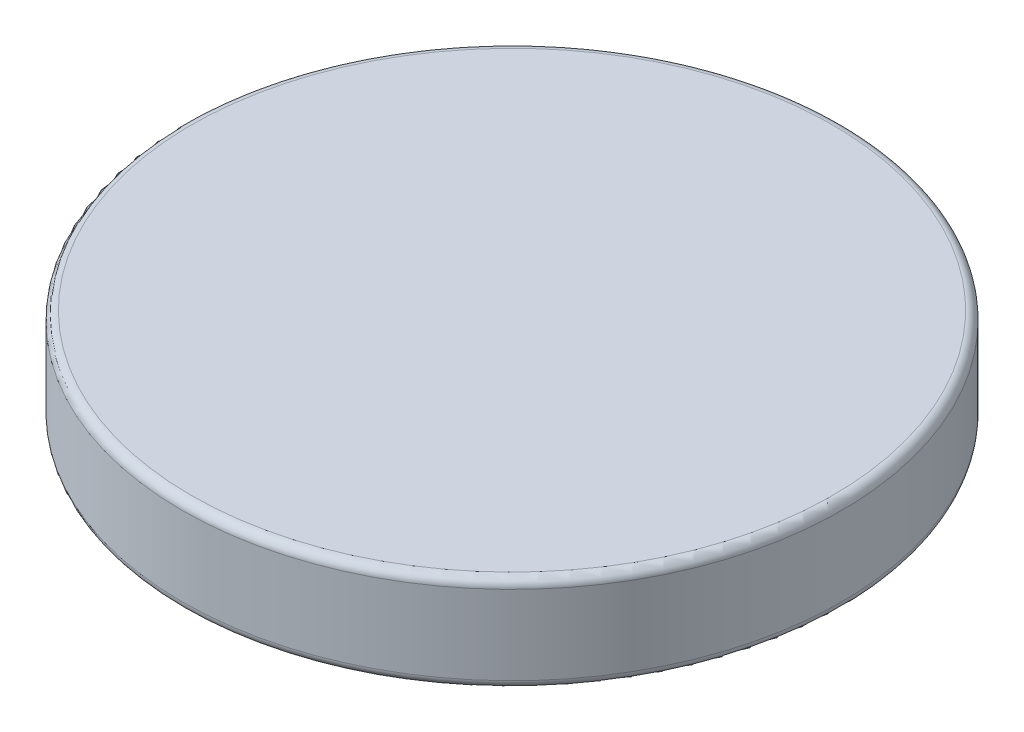
ISO-10303-21;
HEADER;
FILE_DESCRIPTION(('STEP AP214'),'2;1');
FILE_NAME('part.step','',(''),(''),'','','');
FILE_SCHEMA(('AUTOMOTIVE_DESIGN { 1 0 10303 214 1 1 1 1 }'));
ENDSEC;
DATA;
#1=APPLICATION_CONTEXT('core data for automotive mechanical design processes');
#2=APPLICATION_PROTOCOL_DEFINITION('international standard','automotive_design',2000,#1);
#3=PRODUCT_CONTEXT('',#1,'mechanical');
#4=PRODUCT('Part','Part','',(#3));
#5=PRODUCT_RELATED_PRODUCT_CATEGORY('part','',(#4));
#6=PRODUCT_DEFINITION_FORMATION('','',#4);
#7=PRODUCT_DEFINITION_CONTEXT('part definition',#1,'design');
#8=PRODUCT_DEFINITION('design','',#6,#7);
#9=PRODUCT_DEFINITION_SHAPE('','',#8);
#10=(LENGTH_UNIT() NAMED_UNIT(*) SI_UNIT(.MILLI.,.METRE.));
#11=(NAMED_UNIT(*) PLANE_ANGLE_UNIT() SI_UNIT($,.RADIAN.));
#12=(NAMED_UNIT(*) SI_UNIT($,.STERADIAN.) SOLID_ANGLE_UNIT());
#13=UNCERTAINTY_MEASURE_WITH_UNIT(LENGTH_MEASURE(1.E-05),#10,'distance_accuracy_value','');
#14=(GEOMETRIC_REPRESENTATION_CONTEXT(3) GLOBAL_UNCERTAINTY_ASSIGNED_CONTEXT((#13)) GLOBAL_UNIT_ASSIGNED_CONTEXT((#10,
#11,#12)) REPRESENTATION_CONTEXT('',''));
#15=CARTESIAN_POINT('',(0.,0.,0.));
#16=DIRECTION('',(0.,0.,1.));
#17=DIRECTION('',(1.,0.,0.));
#18=AXIS2_PLACEMENT_3D('',#15,#16,#17);
#19=CARTESIAN_POINT('',(0.,1.1,0.));
#20=DIRECTION('',(0.,-1.,0.));
#21=DIRECTION('',(0.,0.,-1.));
#22=AXIS2_PLACEMENT_3D('',#19,#20,#21);
#23=CYLINDRICAL_SURFACE('',#22,3.75);
#24=CARTESIAN_POINT('',(0.,0.1,0.));
#25=DIRECTION('',(0.,1.,0.));
#26=DIRECTION('',(0.,0.,1.));
#27=AXIS2_PLACEMENT_3D('',#24,#25,#26);
#28=CIRCLE('',#27,3.75);
#29=CARTESIAN_POINT('',(0.,0.1,3.75));
#30=VERTEX_POINT('',#29);
#31=EDGE_CURVE('E45',#30,#30,#28,.T.);
#32=ORIENTED_EDGE('',*,*,#31,.T.);
#33=EDGE_LOOP('',(#32));
#34=FACE_BOUND('',#33,.T.);
#35=CARTESIAN_POINT('',(0.,1.,0.));
#36=DIRECTION('',(0.,1.,0.));
#37=DIRECTION('',(0.,0.,1.));
#38=AXIS2_PLACEMENT_3D('',#35,#36,#37);
#39=CIRCLE('',#38,3.75);
#40=CARTESIAN_POINT('',(0.,1.,3.75));
#41=VERTEX_POINT('',#40);
#42=EDGE_CURVE('E49',#41,#41,#39,.F.);
#43=ORIENTED_EDGE('',*,*,#42,.T.);
#44=EDGE_LOOP('',(#43));
#45=FACE_BOUND('',#44,.T.);
#46=ADVANCED_FACE('F34',(#34,#45),#23,.T.);
#47=CARTESIAN_POINT('',(0.,1.1,0.));
#48=DIRECTION('',(0.,1.,0.));
#49=DIRECTION('',(0.,0.,1.));
#50=AXIS2_PLACEMENT_3D('',#47,#48,#49);
#51=PLANE('',#50);
#52=CARTESIAN_POINT('',(0.,1.1,0.));
#53=DIRECTION('',(0.,1.,0.));
#54=DIRECTION('',(0.,0.,1.));
#55=AXIS2_PLACEMENT_3D('',#52,#53,#54);
#56=CIRCLE('',#55,3.65);
#57=CARTESIAN_POINT('',(0.,1.1,3.65));
#58=VERTEX_POINT('',#57);
#59=EDGE_CURVE('E10',#58,#58,#56,.T.);
#60=ORIENTED_EDGE('',*,*,#59,.T.);
#61=EDGE_LOOP('',(#60));
#62=FACE_BOUND('',#61,.T.);
#63=ADVANCED_FACE('F65',(#62),#51,.T.);
#64=CARTESIAN_POINT('',(0.,0.,0.));
#65=DIRECTION('',(0.,1.,0.));
#66=DIRECTION('',(0.,0.,1.));
#67=AXIS2_PLACEMENT_3D('',#64,#65,#66);
#68=PLANE('',#67);
#69=CARTESIAN_POINT('',(0.,0.,0.));
#70=DIRECTION('',(0.,1.,0.));
#71=DIRECTION('',(0.,0.,1.));
#72=AXIS2_PLACEMENT_3D('',#69,#70,#71);
#73=CIRCLE('',#72,3.65);
#74=CARTESIAN_POINT('',(0.,0.,3.65));
#75=VERTEX_POINT('',#74);
#76=EDGE_CURVE('E41',#75,#75,#73,.F.);
#77=ORIENTED_EDGE('',*,*,#76,.T.);
#78=EDGE_LOOP('',(#77));
#79=FACE_BOUND('',#78,.T.);
#80=ADVANCED_FACE('F62',(#79),#68,.F.);
#81=CARTESIAN_POINT('',(0.,0.1,0.));
#82=DIRECTION('',(0.,1.,0.));
#83=DIRECTION('',(0.,0.,1.));
#84=AXIS2_PLACEMENT_3D('',#81,#82,#83);
#85=TOROIDAL_SURFACE('',#84,3.65,0.1);
#86=ORIENTED_EDGE('',*,*,#76,.F.);
#87=EDGE_LOOP('',(#86));
#88=FACE_BOUND('',#87,.T.);
#89=ORIENTED_EDGE('',*,*,#31,.F.);
#90=EDGE_LOOP('',(#89));
#91=FACE_BOUND('',#90,.T.);
#92=ADVANCED_FACE('F58',(#88,#91),#85,.T.);
#93=CARTESIAN_POINT('',(0.,1.,0.));
#94=DIRECTION('',(0.,1.,0.));
#95=DIRECTION('',(0.,0.,1.));
#96=AXIS2_PLACEMENT_3D('',#93,#94,#95);
#97=TOROIDAL_SURFACE('',#96,3.65,0.1);
#98=ORIENTED_EDGE('',*,*,#42,.F.);
#99=EDGE_LOOP('',(#98));
#100=FACE_BOUND('',#99,.T.);
#101=ORIENTED_EDGE('',*,*,#59,.F.);
#102=EDGE_LOOP('',(#101));
#103=FACE_BOUND('',#102,.T.);
#104=ADVANCED_FACE('F36',(#100,#103),#97,.T.);
#105=CLOSED_SHELL('',(#46,#63,#80,#92,#104));
#106=MANIFOLD_SOLID_BREP('B2',#105);
#107=ADVANCED_BREP_SHAPE_REPRESENTATION('',(#18,#106),#14);
#108=SHAPE_DEFINITION_REPRESENTATION(#9,#107);
ENDSEC;
END-ISO-10303-21;
